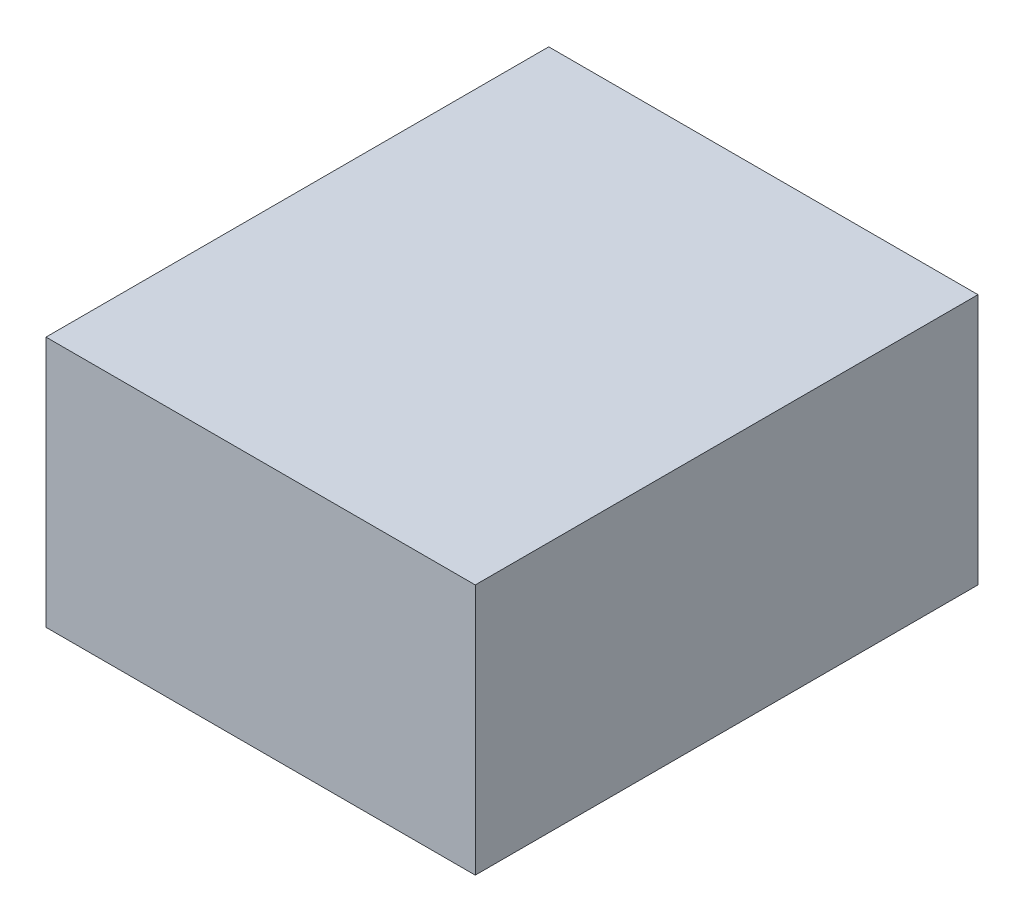
ISO-10303-21;
HEADER;
FILE_DESCRIPTION(('STEP AP214'),'2;1');
FILE_NAME('part.step','',(''),(''),'','','');
FILE_SCHEMA(('AUTOMOTIVE_DESIGN { 1 0 10303 214 1 1 1 1 }'));
ENDSEC;
DATA;
#1=APPLICATION_CONTEXT('core data for automotive mechanical design processes');
#2=APPLICATION_PROTOCOL_DEFINITION('international standard','automotive_design',2000,#1);
#3=PRODUCT_CONTEXT('',#1,'mechanical');
#4=PRODUCT('Part','Part','',(#3));
#5=PRODUCT_RELATED_PRODUCT_CATEGORY('part','',(#4));
#6=PRODUCT_DEFINITION_FORMATION('','',#4);
#7=PRODUCT_DEFINITION_CONTEXT('part definition',#1,'design');
#8=PRODUCT_DEFINITION('design','',#6,#7);
#9=PRODUCT_DEFINITION_SHAPE('','',#8);
#10=(LENGTH_UNIT() NAMED_UNIT(*) SI_UNIT(.MILLI.,.METRE.));
#11=(NAMED_UNIT(*) PLANE_ANGLE_UNIT() SI_UNIT($,.RADIAN.));
#12=(NAMED_UNIT(*) SI_UNIT($,.STERADIAN.) SOLID_ANGLE_UNIT());
#13=UNCERTAINTY_MEASURE_WITH_UNIT(LENGTH_MEASURE(1.E-05),#10,'distance_accuracy_value','');
#14=(GEOMETRIC_REPRESENTATION_CONTEXT(3) GLOBAL_UNCERTAINTY_ASSIGNED_CONTEXT((#13)) GLOBAL_UNIT_ASSIGNED_CONTEXT((#10,
#11,#12)) REPRESENTATION_CONTEXT('',''));
#15=CARTESIAN_POINT('',(0.,0.,0.));
#16=DIRECTION('',(0.,0.,1.));
#17=DIRECTION('',(1.,0.,0.));
#18=AXIS2_PLACEMENT_3D('',#15,#16,#17);
#19=CARTESIAN_POINT('',(-72.6100038590226,65.,-93.898958755486));
#20=DIRECTION('',(1.,0.,0.));
#21=DIRECTION('',(0.,0.,-1.));
#22=AXIS2_PLACEMENT_3D('',#19,#20,#21);
#23=PLANE('',#22);
#24=DIRECTION('',(0.,0.,1.));
#25=VECTOR('',#24,1.);
#26=CARTESIAN_POINT('',(-72.6100038590226,0.,-93.898958755486));
#27=LINE('',#26,#25);
#28=CARTESIAN_POINT('',(-72.6100038590226,0.,-93.898958755486));
#29=VERTEX_POINT('',#28);
#30=CARTESIAN_POINT('',(-72.6100038590226,0.,36.1010412445141));
#31=VERTEX_POINT('',#30);
#32=EDGE_CURVE('E95',#29,#31,#27,.T.);
#33=ORIENTED_EDGE('',*,*,#32,.T.);
#34=DIRECTION('',(0.,-1.,0.));
#35=VECTOR('',#34,1.);
#36=CARTESIAN_POINT('',(-72.6100038590226,65.,36.1010412445141));
#37=LINE('',#36,#35);
#38=CARTESIAN_POINT('',(-72.6100038590226,65.,36.1010412445141));
#39=VERTEX_POINT('',#38);
#40=EDGE_CURVE('E11',#39,#31,#37,.T.);
#41=ORIENTED_EDGE('',*,*,#40,.F.);
#42=DIRECTION('',(0.,0.,1.));
#43=VECTOR('',#42,1.);
#44=CARTESIAN_POINT('',(-72.6100038590226,65.,-93.898958755486));
#45=LINE('',#44,#43);
#46=CARTESIAN_POINT('',(-72.6100038590226,65.,-93.898958755486));
#47=VERTEX_POINT('',#46);
#48=EDGE_CURVE('E83',#47,#39,#45,.T.);
#49=ORIENTED_EDGE('',*,*,#48,.F.);
#50=DIRECTION('',(0.,-1.,0.));
#51=VECTOR('',#50,1.);
#52=CARTESIAN_POINT('',(-72.6100038590226,65.,-93.898958755486));
#53=LINE('',#52,#51);
#54=EDGE_CURVE('E91',#47,#29,#53,.T.);
#55=ORIENTED_EDGE('',*,*,#54,.T.);
#56=EDGE_LOOP('',(#33,#41,#49,#55));
#57=FACE_BOUND('',#56,.T.);
#58=ADVANCED_FACE('F32',(#57),#23,.F.);
#59=CARTESIAN_POINT('',(-72.6100038590226,65.,36.1010412445141));
#60=DIRECTION('',(0.,0.,-1.));
#61=DIRECTION('',(-1.,0.,0.));
#62=AXIS2_PLACEMENT_3D('',#59,#60,#61);
#63=PLANE('',#62);
#64=DIRECTION('',(1.,0.,0.));
#65=VECTOR('',#64,1.);
#66=CARTESIAN_POINT('',(-72.6100038590226,0.,36.1010412445141));
#67=LINE('',#66,#65);
#68=CARTESIAN_POINT('',(38.3899961409774,0.,36.1010412445141));
#69=VERTEX_POINT('',#68);
#70=EDGE_CURVE('E87',#31,#69,#67,.T.);
#71=ORIENTED_EDGE('',*,*,#70,.T.);
#72=DIRECTION('',(0.,-1.,0.));
#73=VECTOR('',#72,1.);
#74=CARTESIAN_POINT('',(38.3899961409774,65.,36.1010412445141));
#75=LINE('',#74,#73);
#76=CARTESIAN_POINT('',(38.3899961409774,65.,36.1010412445141));
#77=VERTEX_POINT('',#76);
#78=EDGE_CURVE('E40',#77,#69,#75,.T.);
#79=ORIENTED_EDGE('',*,*,#78,.F.);
#80=DIRECTION('',(1.,0.,0.));
#81=VECTOR('',#80,1.);
#82=CARTESIAN_POINT('',(-72.6100038590226,65.,36.1010412445141));
#83=LINE('',#82,#81);
#84=EDGE_CURVE('E78',#39,#77,#83,.T.);
#85=ORIENTED_EDGE('',*,*,#84,.F.);
#86=ORIENTED_EDGE('',*,*,#40,.T.);
#87=EDGE_LOOP('',(#71,#79,#85,#86));
#88=FACE_BOUND('',#87,.T.);
#89=ADVANCED_FACE('F86',(#88),#63,.F.);
#90=CARTESIAN_POINT('',(38.3899961409774,65.,-93.898958755486));
#91=DIRECTION('',(-1.,0.,0.));
#92=DIRECTION('',(0.,0.,1.));
#93=AXIS2_PLACEMENT_3D('',#90,#91,#92);
#94=PLANE('',#93);
#95=DIRECTION('',(0.,0.,-1.));
#96=VECTOR('',#95,1.);
#97=CARTESIAN_POINT('',(38.3899961409774,0.,-93.898958755486));
#98=LINE('',#97,#96);
#99=CARTESIAN_POINT('',(38.3899961409774,0.,-93.898958755486));
#100=VERTEX_POINT('',#99);
#101=EDGE_CURVE('E65',#69,#100,#98,.T.);
#102=ORIENTED_EDGE('',*,*,#101,.T.);
#103=DIRECTION('',(0.,-1.,0.));
#104=VECTOR('',#103,1.);
#105=CARTESIAN_POINT('',(38.3899961409774,65.,-93.898958755486));
#106=LINE('',#105,#104);
#107=CARTESIAN_POINT('',(38.3899961409774,65.,-93.898958755486));
#108=VERTEX_POINT('',#107);
#109=EDGE_CURVE('E88',#108,#100,#106,.T.);
#110=ORIENTED_EDGE('',*,*,#109,.F.);
#111=DIRECTION('',(0.,0.,-1.));
#112=VECTOR('',#111,1.);
#113=CARTESIAN_POINT('',(38.3899961409774,65.,-93.898958755486));
#114=LINE('',#113,#112);
#115=EDGE_CURVE('E81',#77,#108,#114,.T.);
#116=ORIENTED_EDGE('',*,*,#115,.F.);
#117=ORIENTED_EDGE('',*,*,#78,.T.);
#118=EDGE_LOOP('',(#102,#110,#116,#117));
#119=FACE_BOUND('',#118,.T.);
#120=ADVANCED_FACE('F89',(#119),#94,.F.);
#121=CARTESIAN_POINT('',(-72.6100038590226,65.,-93.898958755486));
#122=DIRECTION('',(0.,0.,1.));
#123=DIRECTION('',(1.,0.,0.));
#124=AXIS2_PLACEMENT_3D('',#121,#122,#123);
#125=PLANE('',#124);
#126=DIRECTION('',(-1.,0.,0.));
#127=VECTOR('',#126,1.);
#128=CARTESIAN_POINT('',(-72.6100038590226,0.,-93.898958755486));
#129=LINE('',#128,#127);
#130=EDGE_CURVE('E71',#100,#29,#129,.T.);
#131=ORIENTED_EDGE('',*,*,#130,.T.);
#132=ORIENTED_EDGE('',*,*,#54,.F.);
#133=DIRECTION('',(-1.,0.,0.));
#134=VECTOR('',#133,1.);
#135=CARTESIAN_POINT('',(-72.6100038590226,65.,-93.898958755486));
#136=LINE('',#135,#134);
#137=EDGE_CURVE('E48',#108,#47,#136,.T.);
#138=ORIENTED_EDGE('',*,*,#137,.F.);
#139=ORIENTED_EDGE('',*,*,#109,.T.);
#140=EDGE_LOOP('',(#131,#132,#138,#139));
#141=FACE_BOUND('',#140,.T.);
#142=ADVANCED_FACE('F102',(#141),#125,.F.);
#143=CARTESIAN_POINT('',(0.,65.,0.));
#144=DIRECTION('',(0.,1.,0.));
#145=DIRECTION('',(0.,0.,1.));
#146=AXIS2_PLACEMENT_3D('',#143,#144,#145);
#147=PLANE('',#146);
#148=ORIENTED_EDGE('',*,*,#48,.T.);
#149=ORIENTED_EDGE('',*,*,#84,.T.);
#150=ORIENTED_EDGE('',*,*,#115,.T.);
#151=ORIENTED_EDGE('',*,*,#137,.T.);
#152=EDGE_LOOP('',(#148,#149,#150,#151));
#153=FACE_BOUND('',#152,.T.);
#154=ADVANCED_FACE('F79',(#153),#147,.T.);
#155=CARTESIAN_POINT('',(0.,0.,0.));
#156=DIRECTION('',(0.,1.,0.));
#157=DIRECTION('',(0.,0.,1.));
#158=AXIS2_PLACEMENT_3D('',#155,#156,#157);
#159=PLANE('',#158);
#160=ORIENTED_EDGE('',*,*,#32,.F.);
#161=ORIENTED_EDGE('',*,*,#130,.F.);
#162=ORIENTED_EDGE('',*,*,#101,.F.);
#163=ORIENTED_EDGE('',*,*,#70,.F.);
#164=EDGE_LOOP('',(#160,#161,#162,#163));
#165=FACE_BOUND('',#164,.T.);
#166=ADVANCED_FACE('F105',(#165),#159,.F.);
#167=CLOSED_SHELL('',(#58,#89,#120,#142,#154,#166));
#168=MANIFOLD_SOLID_BREP('B2',#167);
#169=ADVANCED_BREP_SHAPE_REPRESENTATION('',(#18,#168),#14);
#170=SHAPE_DEFINITION_REPRESENTATION(#9,#169);
ENDSEC;
END-ISO-10303-21;
